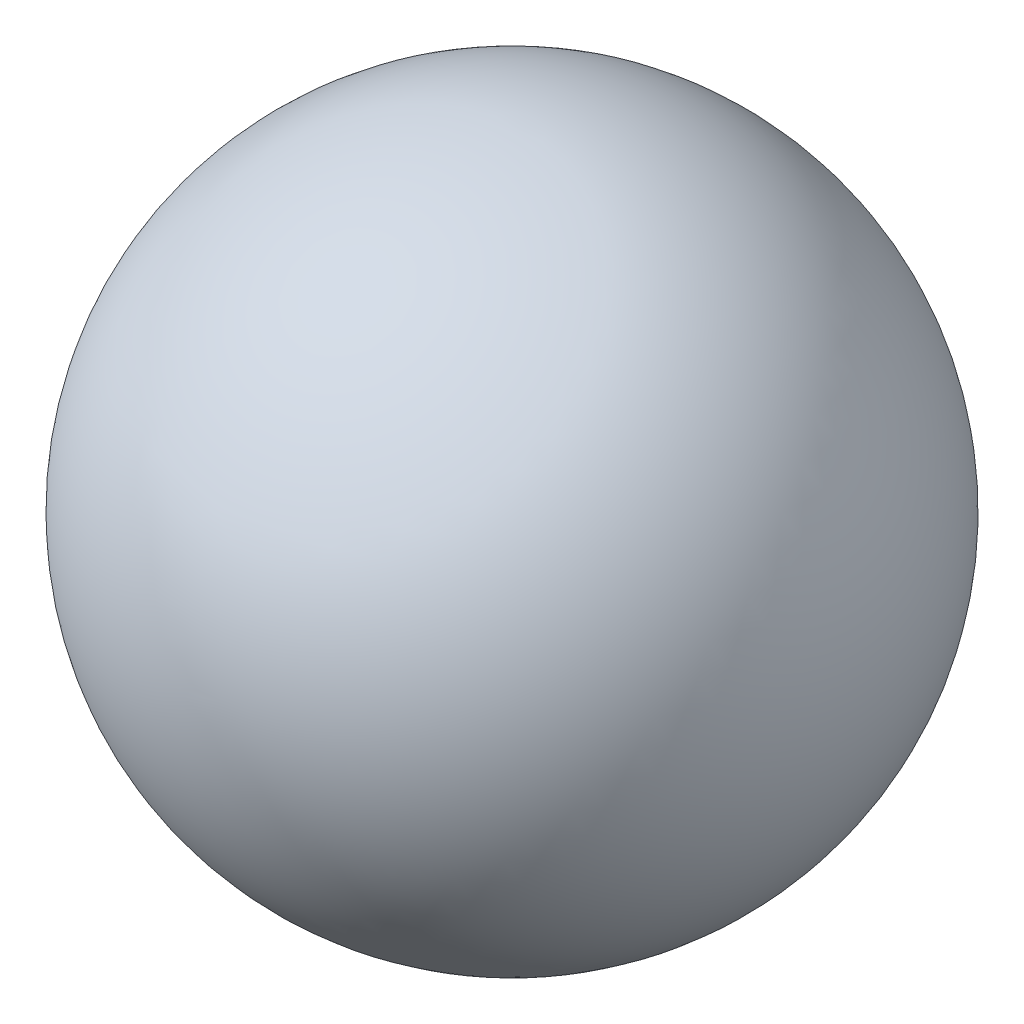
ISO-10303-21;
HEADER;
FILE_DESCRIPTION(('STEP AP214'),'2;1');
FILE_NAME('part.step','',(''),(''),'','','');
FILE_SCHEMA(('AUTOMOTIVE_DESIGN { 1 0 10303 214 1 1 1 1 }'));
ENDSEC;
DATA;
#1=APPLICATION_CONTEXT('core data for automotive mechanical design processes');
#2=APPLICATION_PROTOCOL_DEFINITION('international standard','automotive_design',2000,#1);
#3=PRODUCT_CONTEXT('',#1,'mechanical');
#4=PRODUCT('Part','Part','',(#3));
#5=PRODUCT_RELATED_PRODUCT_CATEGORY('part','',(#4));
#6=PRODUCT_DEFINITION_FORMATION('','',#4);
#7=PRODUCT_DEFINITION_CONTEXT('part definition',#1,'design');
#8=PRODUCT_DEFINITION('design','',#6,#7);
#9=PRODUCT_DEFINITION_SHAPE('','',#8);
#10=(LENGTH_UNIT() NAMED_UNIT(*) SI_UNIT(.MILLI.,.METRE.));
#11=(NAMED_UNIT(*) PLANE_ANGLE_UNIT() SI_UNIT($,.RADIAN.));
#12=(NAMED_UNIT(*) SI_UNIT($,.STERADIAN.) SOLID_ANGLE_UNIT());
#13=UNCERTAINTY_MEASURE_WITH_UNIT(LENGTH_MEASURE(1.E-05),#10,'distance_accuracy_value','');
#14=(GEOMETRIC_REPRESENTATION_CONTEXT(3) GLOBAL_UNCERTAINTY_ASSIGNED_CONTEXT((#13)) GLOBAL_UNIT_ASSIGNED_CONTEXT((#10,
#11,#12)) REPRESENTATION_CONTEXT('',''));
#15=CARTESIAN_POINT('',(0.,0.,0.));
#16=DIRECTION('',(0.,0.,1.));
#17=DIRECTION('',(1.,0.,0.));
#18=AXIS2_PLACEMENT_3D('',#15,#16,#17);
#19=CARTESIAN_POINT('',(0.,0.,0.));
#20=DIRECTION('',(0.,0.,-1.));
#21=DIRECTION('',(1.,0.,0.));
#22=AXIS2_PLACEMENT_3D('',#19,#20,#21);
#23=SPHERICAL_SURFACE('',#22,10.);
#24=CARTESIAN_POINT('',(0.,0.,0.));
#25=DIRECTION('',(0.,1.,0.));
#26=DIRECTION('',(0.,0.,1.));
#27=AXIS2_PLACEMENT_3D('',#24,#25,#26);
#28=SPHERICAL_SURFACE('',#27,10.);
#29=CARTESIAN_POINT('',(0.,-9.68245836551854,0.));
#30=DIRECTION('',(0.,1.,0.));
#31=DIRECTION('',(0.,0.,1.));
#32=AXIS2_PLACEMENT_3D('',#29,#30,#31);
#33=CIRCLE('',#32,2.5);
#34=CARTESIAN_POINT('',(0.,-9.68245836551854,2.5));
#35=VERTEX_POINT('',#34);
#36=EDGE_CURVE('E10',#35,#35,#33,.T.);
#37=ORIENTED_EDGE('',*,*,#36,.T.);
#38=EDGE_LOOP('',(#37));
#39=FACE_BOUND('',#38,.T.);
#40=ADVANCED_FACE('F35',(#39),#28,.T.);
#41=CARTESIAN_POINT('',(0.,-10.,0.));
#42=DIRECTION('',(0.,1.,0.));
#43=DIRECTION('',(0.,0.,1.));
#44=AXIS2_PLACEMENT_3D('',#41,#42,#43);
#45=CYLINDRICAL_SURFACE('',#44,2.5);
#46=CARTESIAN_POINT('',(0.,0.,0.));
#47=DIRECTION('',(0.,1.,0.));
#48=DIRECTION('',(0.,0.,1.));
#49=AXIS2_PLACEMENT_3D('',#46,#47,#48);
#50=CIRCLE('',#49,2.5);
#51=CARTESIAN_POINT('',(0.,0.,2.5));
#52=VERTEX_POINT('',#51);
#53=EDGE_CURVE('E41',#52,#52,#50,.T.);
#54=ORIENTED_EDGE('',*,*,#53,.T.);
#55=EDGE_LOOP('',(#54));
#56=FACE_BOUND('',#55,.T.);
#57=ORIENTED_EDGE('',*,*,#36,.F.);
#58=EDGE_LOOP('',(#57));
#59=FACE_BOUND('',#58,.T.);
#60=ADVANCED_FACE('F47',(#56,#59),#45,.F.);
#61=CARTESIAN_POINT('',(0.,0.,0.));
#62=DIRECTION('',(0.,1.,0.));
#63=DIRECTION('',(0.,0.,1.));
#64=AXIS2_PLACEMENT_3D('',#61,#62,#63);
#65=PLANE('',#64);
#66=ORIENTED_EDGE('',*,*,#53,.F.);
#67=EDGE_LOOP('',(#66));
#68=FACE_BOUND('',#67,.T.);
#69=ADVANCED_FACE('F50',(#68),#65,.F.);
#70=CLOSED_SHELL('',(#40,#60,#69));
#71=MANIFOLD_SOLID_BREP('B2',#70);
#72=ADVANCED_BREP_SHAPE_REPRESENTATION('',(#18,#71),#14);
#73=SHAPE_DEFINITION_REPRESENTATION(#9,#72);
ENDSEC;
END-ISO-10303-21;
